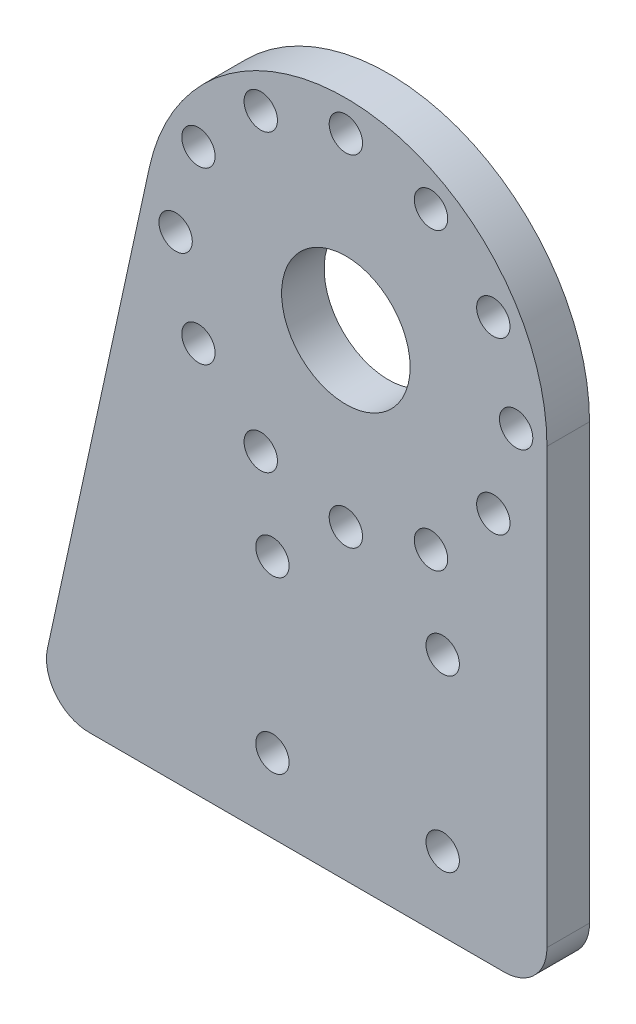
ISO-10303-21;
HEADER;
FILE_DESCRIPTION(('STEP AP214'),'2;1');
FILE_NAME('part.step','',(''),(''),'','','');
FILE_SCHEMA(('AUTOMOTIVE_DESIGN { 1 0 10303 214 1 1 1 1 }'));
ENDSEC;
DATA;
#1=APPLICATION_CONTEXT('core data for automotive mechanical design processes');
#2=APPLICATION_PROTOCOL_DEFINITION('international standard','automotive_design',2000,#1);
#3=PRODUCT_CONTEXT('',#1,'mechanical');
#4=PRODUCT('Part','Part','',(#3));
#5=PRODUCT_RELATED_PRODUCT_CATEGORY('part','',(#4));
#6=PRODUCT_DEFINITION_FORMATION('','',#4);
#7=PRODUCT_DEFINITION_CONTEXT('part definition',#1,'design');
#8=PRODUCT_DEFINITION('design','',#6,#7);
#9=PRODUCT_DEFINITION_SHAPE('','',#8);
#10=(LENGTH_UNIT() NAMED_UNIT(*) SI_UNIT(.MILLI.,.METRE.));
#11=(NAMED_UNIT(*) PLANE_ANGLE_UNIT() SI_UNIT($,.RADIAN.));
#12=(NAMED_UNIT(*) SI_UNIT($,.STERADIAN.) SOLID_ANGLE_UNIT());
#13=UNCERTAINTY_MEASURE_WITH_UNIT(LENGTH_MEASURE(1.E-05),#10,'distance_accuracy_value','');
#14=(GEOMETRIC_REPRESENTATION_CONTEXT(3) GLOBAL_UNCERTAINTY_ASSIGNED_CONTEXT((#13)) GLOBAL_UNIT_ASSIGNED_CONTEXT((#10,
#11,#12)) REPRESENTATION_CONTEXT('',''));
#15=CARTESIAN_POINT('',(0.,0.,0.));
#16=DIRECTION('',(0.,0.,1.));
#17=DIRECTION('',(1.,0.,0.));
#18=AXIS2_PLACEMENT_3D('',#15,#16,#17);
#19=CARTESIAN_POINT('',(406.399999999988,135.229599999999,0.));
#20=DIRECTION('',(0.,0.,1.));
#21=DIRECTION('',(1.,0.,0.));
#22=AXIS2_PLACEMENT_3D('',#19,#20,#21);
#23=CYLINDRICAL_SURFACE('',#22,2.48920000001143);
#24=CARTESIAN_POINT('',(406.399999999988,135.229599999999,0.));
#25=DIRECTION('',(0.,0.,1.));
#26=DIRECTION('',(1.,0.,0.));
#27=AXIS2_PLACEMENT_3D('',#24,#25,#26);
#28=CIRCLE('',#27,2.48920000001143);
#29=CARTESIAN_POINT('',(408.8892,135.229599999999,0.));
#30=VERTEX_POINT('',#29);
#31=EDGE_CURVE('E129',#30,#30,#28,.T.);
#32=ORIENTED_EDGE('',*,*,#31,.F.);
#33=EDGE_LOOP('',(#32));
#34=FACE_BOUND('',#33,.T.);
#35=CARTESIAN_POINT('',(406.399999999988,135.229599999999,6.35));
#36=DIRECTION('',(0.,0.,1.));
#37=DIRECTION('',(1.,0.,0.));
#38=AXIS2_PLACEMENT_3D('',#35,#36,#37);
#39=CIRCLE('',#38,2.48920000001143);
#40=CARTESIAN_POINT('',(408.8892,135.229599999999,6.35));
#41=VERTEX_POINT('',#40);
#42=EDGE_CURVE('E132',#41,#41,#39,.T.);
#43=ORIENTED_EDGE('',*,*,#42,.T.);
#44=EDGE_LOOP('',(#43));
#45=FACE_BOUND('',#44,.T.);
#46=ADVANCED_FACE('F39',(#34,#45),#23,.F.);
#47=CARTESIAN_POINT('',(380.999999999988,135.229599999999,0.));
#48=DIRECTION('',(0.,0.,1.));
#49=DIRECTION('',(1.,0.,0.));
#50=AXIS2_PLACEMENT_3D('',#47,#48,#49);
#51=CYLINDRICAL_SURFACE('',#50,2.48920000001143);
#52=CARTESIAN_POINT('',(380.999999999988,135.229599999999,0.));
#53=DIRECTION('',(0.,0.,1.));
#54=DIRECTION('',(1.,0.,0.));
#55=AXIS2_PLACEMENT_3D('',#52,#53,#54);
#56=CIRCLE('',#55,2.48920000001143);
#57=CARTESIAN_POINT('',(383.4892,135.229599999999,0.));
#58=VERTEX_POINT('',#57);
#59=EDGE_CURVE('E118',#58,#58,#56,.T.);
#60=ORIENTED_EDGE('',*,*,#59,.F.);
#61=EDGE_LOOP('',(#60));
#62=FACE_BOUND('',#61,.T.);
#63=CARTESIAN_POINT('',(380.999999999988,135.229599999999,6.35));
#64=DIRECTION('',(0.,0.,1.));
#65=DIRECTION('',(1.,0.,0.));
#66=AXIS2_PLACEMENT_3D('',#63,#64,#65);
#67=CIRCLE('',#66,2.48920000001143);
#68=CARTESIAN_POINT('',(383.4892,135.229599999999,6.35));
#69=VERTEX_POINT('',#68);
#70=EDGE_CURVE('E121',#69,#69,#67,.T.);
#71=ORIENTED_EDGE('',*,*,#70,.T.);
#72=EDGE_LOOP('',(#71));
#73=FACE_BOUND('',#72,.T.);
#74=ADVANCED_FACE('F312',(#62,#73),#51,.F.);
#75=CARTESIAN_POINT('',(421.956986168853,1.31739696694627E-12,6.35));
#76=DIRECTION('',(-1.,0.,0.));
#77=DIRECTION('',(0.,-1.,0.));
#78=AXIS2_PLACEMENT_3D('',#75,#76,#77);
#79=PLANE('',#78);
#80=DIRECTION('',(0.,1.,0.));
#81=VECTOR('',#80,1.);
#82=CARTESIAN_POINT('',(421.956986168853,1.31739696694627E-12,6.35));
#83=LINE('',#82,#81);
#84=CARTESIAN_POINT('',(421.956986168853,105.155999999999,6.35));
#85=VERTEX_POINT('',#84);
#86=CARTESIAN_POINT('',(421.956986168852,169.926,6.35));
#87=VERTEX_POINT('',#86);
#88=EDGE_CURVE('E93',#85,#87,#83,.T.);
#89=ORIENTED_EDGE('',*,*,#88,.F.);
#90=DIRECTION('',(0.,0.,-1.));
#91=VECTOR('',#90,1.);
#92=CARTESIAN_POINT('',(421.956986168853,105.155999999999,6.35));
#93=LINE('',#92,#91);
#94=CARTESIAN_POINT('',(421.956986168853,105.155999999999,0.));
#95=VERTEX_POINT('',#94);
#96=EDGE_CURVE('E135',#85,#95,#93,.T.);
#97=ORIENTED_EDGE('',*,*,#96,.T.);
#98=DIRECTION('',(0.,1.,0.));
#99=VECTOR('',#98,1.);
#100=CARTESIAN_POINT('',(421.956986168853,1.31739696694627E-12,0.));
#101=LINE('',#100,#99);
#102=CARTESIAN_POINT('',(421.956986168852,169.926,0.));
#103=VERTEX_POINT('',#102);
#104=EDGE_CURVE('E116',#95,#103,#101,.T.);
#105=ORIENTED_EDGE('',*,*,#104,.T.);
#106=DIRECTION('',(0.,0.,-1.));
#107=VECTOR('',#106,1.);
#108=CARTESIAN_POINT('',(421.956986168852,169.926,6.35));
#109=LINE('',#108,#107);
#110=EDGE_CURVE('E109',#87,#103,#109,.T.);
#111=ORIENTED_EDGE('',*,*,#110,.F.);
#112=EDGE_LOOP('',(#89,#97,#105,#111));
#113=FACE_BOUND('',#112,.T.);
#114=ADVANCED_FACE('F114',(#113),#79,.F.);
#115=CARTESIAN_POINT('',(391.956986224852,169.926,6.35));
#116=DIRECTION('',(0.,0.,-1.));
#117=DIRECTION('',(-1.,0.,0.));
#118=AXIS2_PLACEMENT_3D('',#115,#116,#117);
#119=CYLINDRICAL_SURFACE('',#118,29.999999944);
#120=CARTESIAN_POINT('',(391.956986224852,169.926,0.));
#121=DIRECTION('',(0.,0.,1.));
#122=DIRECTION('',(1.,0.,0.));
#123=AXIS2_PLACEMENT_3D('',#120,#121,#122);
#124=CIRCLE('',#123,29.999999944);
#125=CARTESIAN_POINT('',(362.644715782763,176.31276742725,0.));
#126=VERTEX_POINT('',#125);
#127=EDGE_CURVE('E159',#103,#126,#124,.T.);
#128=ORIENTED_EDGE('',*,*,#127,.T.);
#129=DIRECTION('',(0.,0.,-1.));
#130=VECTOR('',#129,1.);
#131=CARTESIAN_POINT('',(362.644715782763,176.31276742725,6.35));
#132=LINE('',#131,#130);
#133=CARTESIAN_POINT('',(362.644715782763,176.31276742725,6.35));
#134=VERTEX_POINT('',#133);
#135=EDGE_CURVE('E111',#134,#126,#132,.T.);
#136=ORIENTED_EDGE('',*,*,#135,.F.);
#137=CARTESIAN_POINT('',(391.956986224852,169.926,6.35));
#138=DIRECTION('',(0.,0.,1.));
#139=DIRECTION('',(1.,0.,0.));
#140=AXIS2_PLACEMENT_3D('',#137,#138,#139);
#141=CIRCLE('',#140,29.999999944);
#142=EDGE_CURVE('E97',#87,#134,#141,.T.);
#143=ORIENTED_EDGE('',*,*,#142,.F.);
#144=ORIENTED_EDGE('',*,*,#110,.T.);
#145=EDGE_LOOP('',(#128,#136,#143,#144));
#146=FACE_BOUND('',#145,.T.);
#147=ADVANCED_FACE('F108',(#146),#119,.T.);
#148=CARTESIAN_POINT('',(309.533386783101,-67.4433512838376,6.35));
#149=DIRECTION('',(0.977075683226871,-0.212892247972402,0.));
#150=DIRECTION('',(0.212892247972402,0.977075683226871,0.));
#151=AXIS2_PLACEMENT_3D('',#148,#149,#150);
#152=PLANE('',#151);
#153=DIRECTION('',(-0.212892247972402,-0.977075683226871,0.));
#154=VECTOR('',#153,1.);
#155=CARTESIAN_POINT('',(309.533386783101,-67.4433512838376,0.));
#156=LINE('',#155,#154);
#157=CARTESIAN_POINT('',(347.435123846915,106.507865774624,0.));
#158=VERTEX_POINT('',#157);
#159=EDGE_CURVE('E156',#126,#158,#156,.T.);
#160=ORIENTED_EDGE('',*,*,#159,.T.);
#161=DIRECTION('',(0.,0.,-1.));
#162=VECTOR('',#161,1.);
#163=CARTESIAN_POINT('',(347.435123846915,106.507865774624,6.35));
#164=LINE('',#163,#162);
#165=CARTESIAN_POINT('',(347.435123846915,106.507865774624,6.35));
#166=VERTEX_POINT('',#165);
#167=EDGE_CURVE('E11',#158,#166,#164,.F.);
#168=ORIENTED_EDGE('',*,*,#167,.T.);
#169=DIRECTION('',(-0.212892247972402,-0.977075683226871,0.));
#170=VECTOR('',#169,1.);
#171=CARTESIAN_POINT('',(309.533386783101,-67.4433512838376,6.35));
#172=LINE('',#171,#170);
#173=EDGE_CURVE('E112',#134,#166,#172,.T.);
#174=ORIENTED_EDGE('',*,*,#173,.F.);
#175=ORIENTED_EDGE('',*,*,#135,.T.);
#176=EDGE_LOOP('',(#160,#168,#174,#175));
#177=FACE_BOUND('',#176,.T.);
#178=ADVANCED_FACE('F158',(#177),#152,.F.);
#179=CARTESIAN_POINT('',(391.956986224852,195.326,6.35));
#180=DIRECTION('',(0.,0.,-1.));
#181=DIRECTION('',(-1.,0.,0.));
#182=AXIS2_PLACEMENT_3D('',#179,#180,#181);
#183=CYLINDRICAL_SURFACE('',#182,2.48920000000001);
#184=CARTESIAN_POINT('',(391.956986224852,195.326,6.35));
#185=DIRECTION('',(0.,0.,1.));
#186=DIRECTION('',(1.,0.,0.));
#187=AXIS2_PLACEMENT_3D('',#184,#185,#186);
#188=CIRCLE('',#187,2.48920000000001);
#189=CARTESIAN_POINT('',(394.446186224852,195.326,6.35));
#190=VERTEX_POINT('',#189);
#191=EDGE_CURVE('E104',#190,#190,#188,.T.);
#192=ORIENTED_EDGE('',*,*,#191,.T.);
#193=EDGE_LOOP('',(#192));
#194=FACE_BOUND('',#193,.T.);
#195=CARTESIAN_POINT('',(391.956986224852,195.326,0.));
#196=DIRECTION('',(0.,0.,1.));
#197=DIRECTION('',(1.,0.,0.));
#198=AXIS2_PLACEMENT_3D('',#195,#196,#197);
#199=CIRCLE('',#198,2.48920000000001);
#200=CARTESIAN_POINT('',(394.446186224852,195.326,0.));
#201=VERTEX_POINT('',#200);
#202=EDGE_CURVE('E165',#201,#201,#199,.T.);
#203=ORIENTED_EDGE('',*,*,#202,.F.);
#204=EDGE_LOOP('',(#203));
#205=FACE_BOUND('',#204,.T.);
#206=ADVANCED_FACE('F296',(#194,#205),#183,.F.);
#207=CARTESIAN_POINT('',(404.656986224852,191.923045256125,6.35));
#208=DIRECTION('',(0.,0.,-1.));
#209=DIRECTION('',(-1.,0.,0.));
#210=AXIS2_PLACEMENT_3D('',#207,#208,#209);
#211=CYLINDRICAL_SURFACE('',#210,2.48920000000001);
#212=CARTESIAN_POINT('',(404.656986224852,191.923045256125,6.35));
#213=DIRECTION('',(0.,0.,1.));
#214=DIRECTION('',(1.,0.,0.));
#215=AXIS2_PLACEMENT_3D('',#212,#213,#214);
#216=CIRCLE('',#215,2.48920000000001);
#217=CARTESIAN_POINT('',(407.146186224852,191.923045256125,6.35));
#218=VERTEX_POINT('',#217);
#219=EDGE_CURVE('E208',#218,#218,#216,.T.);
#220=ORIENTED_EDGE('',*,*,#219,.T.);
#221=EDGE_LOOP('',(#220));
#222=FACE_BOUND('',#221,.T.);
#223=CARTESIAN_POINT('',(404.656986224852,191.923045256125,0.));
#224=DIRECTION('',(0.,0.,1.));
#225=DIRECTION('',(1.,0.,0.));
#226=AXIS2_PLACEMENT_3D('',#223,#224,#225);
#227=CIRCLE('',#226,2.48920000000001);
#228=CARTESIAN_POINT('',(407.146186224852,191.923045256125,0.));
#229=VERTEX_POINT('',#228);
#230=EDGE_CURVE('E168',#229,#229,#227,.T.);
#231=ORIENTED_EDGE('',*,*,#230,.F.);
#232=EDGE_LOOP('',(#231));
#233=FACE_BOUND('',#232,.T.);
#234=ADVANCED_FACE('F299',(#222,#233),#211,.F.);
#235=CARTESIAN_POINT('',(413.954031480977,182.626,6.35));
#236=DIRECTION('',(0.,0.,-1.));
#237=DIRECTION('',(-1.,0.,0.));
#238=AXIS2_PLACEMENT_3D('',#235,#236,#237);
#239=CYLINDRICAL_SURFACE('',#238,2.48920000000001);
#240=CARTESIAN_POINT('',(413.954031480977,182.626,6.35));
#241=DIRECTION('',(0.,0.,1.));
#242=DIRECTION('',(1.,0.,0.));
#243=AXIS2_PLACEMENT_3D('',#240,#241,#242);
#244=CIRCLE('',#243,2.48920000000001);
#245=CARTESIAN_POINT('',(416.443231480977,182.626,6.35));
#246=VERTEX_POINT('',#245);
#247=EDGE_CURVE('E211',#246,#246,#244,.T.);
#248=ORIENTED_EDGE('',*,*,#247,.T.);
#249=EDGE_LOOP('',(#248));
#250=FACE_BOUND('',#249,.T.);
#251=CARTESIAN_POINT('',(413.954031480977,182.626,0.));
#252=DIRECTION('',(0.,0.,1.));
#253=DIRECTION('',(1.,0.,0.));
#254=AXIS2_PLACEMENT_3D('',#251,#252,#253);
#255=CIRCLE('',#254,2.48920000000001);
#256=CARTESIAN_POINT('',(416.443231480977,182.626,0.));
#257=VERTEX_POINT('',#256);
#258=EDGE_CURVE('E171',#257,#257,#255,.T.);
#259=ORIENTED_EDGE('',*,*,#258,.F.);
#260=EDGE_LOOP('',(#259));
#261=FACE_BOUND('',#260,.T.);
#262=ADVANCED_FACE('F511',(#250,#261),#239,.F.);
#263=CARTESIAN_POINT('',(417.356986224852,169.926,6.35));
#264=DIRECTION('',(0.,0.,-1.));
#265=DIRECTION('',(-1.,0.,0.));
#266=AXIS2_PLACEMENT_3D('',#263,#264,#265);
#267=CYLINDRICAL_SURFACE('',#266,2.48920000000001);
#268=CARTESIAN_POINT('',(417.356986224852,169.926,6.35));
#269=DIRECTION('',(0.,0.,1.));
#270=DIRECTION('',(1.,0.,0.));
#271=AXIS2_PLACEMENT_3D('',#268,#269,#270);
#272=CIRCLE('',#271,2.48920000000001);
#273=CARTESIAN_POINT('',(419.846186224852,169.926,6.35));
#274=VERTEX_POINT('',#273);
#275=EDGE_CURVE('E214',#274,#274,#272,.T.);
#276=ORIENTED_EDGE('',*,*,#275,.T.);
#277=EDGE_LOOP('',(#276));
#278=FACE_BOUND('',#277,.T.);
#279=CARTESIAN_POINT('',(417.356986224852,169.926,0.));
#280=DIRECTION('',(0.,0.,1.));
#281=DIRECTION('',(1.,0.,0.));
#282=AXIS2_PLACEMENT_3D('',#279,#280,#281);
#283=CIRCLE('',#282,2.48920000000001);
#284=CARTESIAN_POINT('',(419.846186224852,169.926,0.));
#285=VERTEX_POINT('',#284);
#286=EDGE_CURVE('E174',#285,#285,#283,.T.);
#287=ORIENTED_EDGE('',*,*,#286,.F.);
#288=EDGE_LOOP('',(#287));
#289=FACE_BOUND('',#288,.T.);
#290=ADVANCED_FACE('F500',(#278,#289),#267,.F.);
#291=CARTESIAN_POINT('',(413.954031480977,157.226,6.35));
#292=DIRECTION('',(0.,0.,-1.));
#293=DIRECTION('',(-1.,0.,0.));
#294=AXIS2_PLACEMENT_3D('',#291,#292,#293);
#295=CYLINDRICAL_SURFACE('',#294,2.48920000000001);
#296=CARTESIAN_POINT('',(413.954031480977,157.226,6.35));
#297=DIRECTION('',(0.,0.,1.));
#298=DIRECTION('',(1.,0.,0.));
#299=AXIS2_PLACEMENT_3D('',#296,#297,#298);
#300=CIRCLE('',#299,2.48920000000001);
#301=CARTESIAN_POINT('',(416.443231480977,157.226,6.35));
#302=VERTEX_POINT('',#301);
#303=EDGE_CURVE('E217',#302,#302,#300,.T.);
#304=ORIENTED_EDGE('',*,*,#303,.T.);
#305=EDGE_LOOP('',(#304));
#306=FACE_BOUND('',#305,.T.);
#307=CARTESIAN_POINT('',(413.954031480977,157.226,0.));
#308=DIRECTION('',(0.,0.,1.));
#309=DIRECTION('',(1.,0.,0.));
#310=AXIS2_PLACEMENT_3D('',#307,#308,#309);
#311=CIRCLE('',#310,2.48920000000001);
#312=CARTESIAN_POINT('',(416.443231480977,157.226,0.));
#313=VERTEX_POINT('',#312);
#314=EDGE_CURVE('E177',#313,#313,#311,.T.);
#315=ORIENTED_EDGE('',*,*,#314,.F.);
#316=EDGE_LOOP('',(#315));
#317=FACE_BOUND('',#316,.T.);
#318=ADVANCED_FACE('F489',(#306,#317),#295,.F.);
#319=CARTESIAN_POINT('',(404.656986224852,147.928954743875,6.35));
#320=DIRECTION('',(0.,0.,-1.));
#321=DIRECTION('',(-1.,0.,0.));
#322=AXIS2_PLACEMENT_3D('',#319,#320,#321);
#323=CYLINDRICAL_SURFACE('',#322,2.48920000000001);
#324=CARTESIAN_POINT('',(404.656986224852,147.928954743875,6.35));
#325=DIRECTION('',(0.,0.,1.));
#326=DIRECTION('',(1.,0.,0.));
#327=AXIS2_PLACEMENT_3D('',#324,#325,#326);
#328=CIRCLE('',#327,2.48920000000001);
#329=CARTESIAN_POINT('',(407.146186224852,147.928954743875,6.35));
#330=VERTEX_POINT('',#329);
#331=EDGE_CURVE('E220',#330,#330,#328,.T.);
#332=ORIENTED_EDGE('',*,*,#331,.T.);
#333=EDGE_LOOP('',(#332));
#334=FACE_BOUND('',#333,.T.);
#335=CARTESIAN_POINT('',(404.656986224852,147.928954743875,0.));
#336=DIRECTION('',(0.,0.,1.));
#337=DIRECTION('',(1.,0.,0.));
#338=AXIS2_PLACEMENT_3D('',#335,#336,#337);
#339=CIRCLE('',#338,2.48920000000001);
#340=CARTESIAN_POINT('',(407.146186224852,147.928954743875,0.));
#341=VERTEX_POINT('',#340);
#342=EDGE_CURVE('E180',#341,#341,#339,.T.);
#343=ORIENTED_EDGE('',*,*,#342,.F.);
#344=EDGE_LOOP('',(#343));
#345=FACE_BOUND('',#344,.T.);
#346=ADVANCED_FACE('F478',(#334,#345),#323,.F.);
#347=CARTESIAN_POINT('',(391.956986224852,144.526,6.35));
#348=DIRECTION('',(0.,0.,-1.));
#349=DIRECTION('',(-1.,0.,0.));
#350=AXIS2_PLACEMENT_3D('',#347,#348,#349);
#351=CYLINDRICAL_SURFACE('',#350,2.48920000000001);
#352=CARTESIAN_POINT('',(391.956986224852,144.526,6.35));
#353=DIRECTION('',(0.,0.,1.));
#354=DIRECTION('',(1.,0.,0.));
#355=AXIS2_PLACEMENT_3D('',#352,#353,#354);
#356=CIRCLE('',#355,2.48920000000001);
#357=CARTESIAN_POINT('',(394.446186224852,144.526,6.35));
#358=VERTEX_POINT('',#357);
#359=EDGE_CURVE('E223',#358,#358,#356,.T.);
#360=ORIENTED_EDGE('',*,*,#359,.T.);
#361=EDGE_LOOP('',(#360));
#362=FACE_BOUND('',#361,.T.);
#363=CARTESIAN_POINT('',(391.956986224852,144.526,0.));
#364=DIRECTION('',(0.,0.,1.));
#365=DIRECTION('',(1.,0.,0.));
#366=AXIS2_PLACEMENT_3D('',#363,#364,#365);
#367=CIRCLE('',#366,2.48920000000001);
#368=CARTESIAN_POINT('',(394.446186224852,144.526,0.));
#369=VERTEX_POINT('',#368);
#370=EDGE_CURVE('E183',#369,#369,#367,.T.);
#371=ORIENTED_EDGE('',*,*,#370,.F.);
#372=EDGE_LOOP('',(#371));
#373=FACE_BOUND('',#372,.T.);
#374=ADVANCED_FACE('F467',(#362,#373),#351,.F.);
#375=CARTESIAN_POINT('',(379.256986224852,147.928954743875,6.35));
#376=DIRECTION('',(0.,0.,-1.));
#377=DIRECTION('',(-1.,0.,0.));
#378=AXIS2_PLACEMENT_3D('',#375,#376,#377);
#379=CYLINDRICAL_SURFACE('',#378,2.48920000000001);
#380=CARTESIAN_POINT('',(379.256986224852,147.928954743875,6.35));
#381=DIRECTION('',(0.,0.,1.));
#382=DIRECTION('',(1.,0.,0.));
#383=AXIS2_PLACEMENT_3D('',#380,#381,#382);
#384=CIRCLE('',#383,2.48920000000001);
#385=CARTESIAN_POINT('',(381.746186224853,147.928954743875,6.35));
#386=VERTEX_POINT('',#385);
#387=EDGE_CURVE('E226',#386,#386,#384,.T.);
#388=ORIENTED_EDGE('',*,*,#387,.T.);
#389=EDGE_LOOP('',(#388));
#390=FACE_BOUND('',#389,.T.);
#391=CARTESIAN_POINT('',(379.256986224852,147.928954743875,0.));
#392=DIRECTION('',(0.,0.,1.));
#393=DIRECTION('',(1.,0.,0.));
#394=AXIS2_PLACEMENT_3D('',#391,#392,#393);
#395=CIRCLE('',#394,2.48920000000001);
#396=CARTESIAN_POINT('',(381.746186224853,147.928954743875,0.));
#397=VERTEX_POINT('',#396);
#398=EDGE_CURVE('E186',#397,#397,#395,.T.);
#399=ORIENTED_EDGE('',*,*,#398,.F.);
#400=EDGE_LOOP('',(#399));
#401=FACE_BOUND('',#400,.T.);
#402=ADVANCED_FACE('F456',(#390,#401),#379,.F.);
#403=CARTESIAN_POINT('',(369.959940968728,157.226,6.35));
#404=DIRECTION('',(0.,0.,-1.));
#405=DIRECTION('',(-1.,0.,0.));
#406=AXIS2_PLACEMENT_3D('',#403,#404,#405);
#407=CYLINDRICAL_SURFACE('',#406,2.48919999999995);
#408=CARTESIAN_POINT('',(369.959940968728,157.226,6.35));
#409=DIRECTION('',(0.,0.,1.));
#410=DIRECTION('',(1.,0.,0.));
#411=AXIS2_PLACEMENT_3D('',#408,#409,#410);
#412=CIRCLE('',#411,2.48919999999995);
#413=CARTESIAN_POINT('',(372.449140968728,157.226,6.35));
#414=VERTEX_POINT('',#413);
#415=EDGE_CURVE('E229',#414,#414,#412,.T.);
#416=ORIENTED_EDGE('',*,*,#415,.T.);
#417=EDGE_LOOP('',(#416));
#418=FACE_BOUND('',#417,.T.);
#419=CARTESIAN_POINT('',(369.959940968728,157.226,0.));
#420=DIRECTION('',(0.,0.,1.));
#421=DIRECTION('',(1.,0.,0.));
#422=AXIS2_PLACEMENT_3D('',#419,#420,#421);
#423=CIRCLE('',#422,2.48919999999995);
#424=CARTESIAN_POINT('',(372.449140968728,157.226,0.));
#425=VERTEX_POINT('',#424);
#426=EDGE_CURVE('E189',#425,#425,#423,.T.);
#427=ORIENTED_EDGE('',*,*,#426,.F.);
#428=EDGE_LOOP('',(#427));
#429=FACE_BOUND('',#428,.T.);
#430=ADVANCED_FACE('F445',(#418,#429),#407,.F.);
#431=CARTESIAN_POINT('',(366.556986224852,169.926,6.35));
#432=DIRECTION('',(0.,0.,-1.));
#433=DIRECTION('',(-1.,0.,0.));
#434=AXIS2_PLACEMENT_3D('',#431,#432,#433);
#435=CYLINDRICAL_SURFACE('',#434,2.48920000000001);
#436=CARTESIAN_POINT('',(366.556986224852,169.926,6.35));
#437=DIRECTION('',(0.,0.,1.));
#438=DIRECTION('',(1.,0.,0.));
#439=AXIS2_PLACEMENT_3D('',#436,#437,#438);
#440=CIRCLE('',#439,2.48920000000001);
#441=CARTESIAN_POINT('',(369.046186224852,169.926,6.35));
#442=VERTEX_POINT('',#441);
#443=EDGE_CURVE('E232',#442,#442,#440,.T.);
#444=ORIENTED_EDGE('',*,*,#443,.T.);
#445=EDGE_LOOP('',(#444));
#446=FACE_BOUND('',#445,.T.);
#447=CARTESIAN_POINT('',(366.556986224852,169.926,0.));
#448=DIRECTION('',(0.,0.,1.));
#449=DIRECTION('',(1.,0.,0.));
#450=AXIS2_PLACEMENT_3D('',#447,#448,#449);
#451=CIRCLE('',#450,2.48920000000001);
#452=CARTESIAN_POINT('',(369.046186224852,169.926,0.));
#453=VERTEX_POINT('',#452);
#454=EDGE_CURVE('E192',#453,#453,#451,.T.);
#455=ORIENTED_EDGE('',*,*,#454,.F.);
#456=EDGE_LOOP('',(#455));
#457=FACE_BOUND('',#456,.T.);
#458=ADVANCED_FACE('F434',(#446,#457),#435,.F.);
#459=CARTESIAN_POINT('',(369.959940968728,182.626,6.35));
#460=DIRECTION('',(0.,0.,-1.));
#461=DIRECTION('',(-1.,0.,0.));
#462=AXIS2_PLACEMENT_3D('',#459,#460,#461);
#463=CYLINDRICAL_SURFACE('',#462,2.48920000000001);
#464=CARTESIAN_POINT('',(369.959940968728,182.626,6.35));
#465=DIRECTION('',(0.,0.,1.));
#466=DIRECTION('',(1.,0.,0.));
#467=AXIS2_PLACEMENT_3D('',#464,#465,#466);
#468=CIRCLE('',#467,2.48920000000001);
#469=CARTESIAN_POINT('',(372.449140968728,182.626,6.35));
#470=VERTEX_POINT('',#469);
#471=EDGE_CURVE('E235',#470,#470,#468,.T.);
#472=ORIENTED_EDGE('',*,*,#471,.T.);
#473=EDGE_LOOP('',(#472));
#474=FACE_BOUND('',#473,.T.);
#475=CARTESIAN_POINT('',(369.959940968728,182.626,0.));
#476=DIRECTION('',(0.,0.,1.));
#477=DIRECTION('',(1.,0.,0.));
#478=AXIS2_PLACEMENT_3D('',#475,#476,#477);
#479=CIRCLE('',#478,2.48920000000001);
#480=CARTESIAN_POINT('',(372.449140968728,182.626,0.));
#481=VERTEX_POINT('',#480);
#482=EDGE_CURVE('E195',#481,#481,#479,.T.);
#483=ORIENTED_EDGE('',*,*,#482,.F.);
#484=EDGE_LOOP('',(#483));
#485=FACE_BOUND('',#484,.T.);
#486=ADVANCED_FACE('F423',(#474,#485),#463,.F.);
#487=CARTESIAN_POINT('',(379.256986224852,191.923045256125,6.35));
#488=DIRECTION('',(0.,0.,-1.));
#489=DIRECTION('',(-1.,0.,0.));
#490=AXIS2_PLACEMENT_3D('',#487,#488,#489);
#491=CYLINDRICAL_SURFACE('',#490,2.48919999999995);
#492=CARTESIAN_POINT('',(379.256986224852,191.923045256125,6.35));
#493=DIRECTION('',(0.,0.,1.));
#494=DIRECTION('',(1.,0.,0.));
#495=AXIS2_PLACEMENT_3D('',#492,#493,#494);
#496=CIRCLE('',#495,2.48919999999995);
#497=CARTESIAN_POINT('',(381.746186224852,191.923045256125,6.35));
#498=VERTEX_POINT('',#497);
#499=EDGE_CURVE('E238',#498,#498,#496,.T.);
#500=ORIENTED_EDGE('',*,*,#499,.T.);
#501=EDGE_LOOP('',(#500));
#502=FACE_BOUND('',#501,.T.);
#503=CARTESIAN_POINT('',(379.256986224852,191.923045256125,0.));
#504=DIRECTION('',(0.,0.,1.));
#505=DIRECTION('',(1.,0.,0.));
#506=AXIS2_PLACEMENT_3D('',#503,#504,#505);
#507=CIRCLE('',#506,2.48919999999995);
#508=CARTESIAN_POINT('',(381.746186224852,191.923045256125,0.));
#509=VERTEX_POINT('',#508);
#510=EDGE_CURVE('E198',#509,#509,#507,.T.);
#511=ORIENTED_EDGE('',*,*,#510,.F.);
#512=EDGE_LOOP('',(#511));
#513=FACE_BOUND('',#512,.T.);
#514=ADVANCED_FACE('F413',(#502,#513),#491,.F.);
#515=CARTESIAN_POINT('',(391.956986224852,169.926,6.35));
#516=DIRECTION('',(0.,0.,-1.));
#517=DIRECTION('',(-1.,0.,0.));
#518=AXIS2_PLACEMENT_3D('',#515,#516,#517);
#519=CYLINDRICAL_SURFACE('',#518,9.5885);
#520=CARTESIAN_POINT('',(391.956986224852,169.926,6.35));
#521=DIRECTION('',(0.,0.,1.));
#522=DIRECTION('',(1.,0.,0.));
#523=AXIS2_PLACEMENT_3D('',#520,#521,#522);
#524=CIRCLE('',#523,9.5885);
#525=CARTESIAN_POINT('',(401.545486224852,169.926,6.35));
#526=VERTEX_POINT('',#525);
#527=EDGE_CURVE('E161',#526,#526,#524,.T.);
#528=ORIENTED_EDGE('',*,*,#527,.T.);
#529=EDGE_LOOP('',(#528));
#530=FACE_BOUND('',#529,.T.);
#531=CARTESIAN_POINT('',(391.956986224852,169.926,0.));
#532=DIRECTION('',(0.,0.,1.));
#533=DIRECTION('',(1.,0.,0.));
#534=AXIS2_PLACEMENT_3D('',#531,#532,#533);
#535=CIRCLE('',#534,9.5885);
#536=CARTESIAN_POINT('',(401.545486224852,169.926,0.));
#537=VERTEX_POINT('',#536);
#538=EDGE_CURVE('E201',#537,#537,#535,.T.);
#539=ORIENTED_EDGE('',*,*,#538,.F.);
#540=EDGE_LOOP('',(#539));
#541=FACE_BOUND('',#540,.T.);
#542=ADVANCED_FACE('F359',(#530,#541),#519,.F.);
#543=CARTESIAN_POINT('',(0.,98.8059999999991,6.35));
#544=DIRECTION('',(0.,1.,0.));
#545=DIRECTION('',(0.,0.,1.));
#546=AXIS2_PLACEMENT_3D('',#543,#544,#545);
#547=PLANE('',#546);
#548=DIRECTION('',(1.,0.,0.));
#549=VECTOR('',#548,1.);
#550=CARTESIAN_POINT('',(0.,98.8059999999991,0.));
#551=LINE('',#550,#549);
#552=CARTESIAN_POINT('',(353.639554435406,98.8059999999991,0.));
#553=VERTEX_POINT('',#552);
#554=CARTESIAN_POINT('',(415.606986168853,98.8059999999991,0.));
#555=VERTEX_POINT('',#554);
#556=EDGE_CURVE('E157',#553,#555,#551,.T.);
#557=ORIENTED_EDGE('',*,*,#556,.T.);
#558=DIRECTION('',(0.,0.,-1.));
#559=VECTOR('',#558,1.);
#560=CARTESIAN_POINT('',(415.606986168853,98.8059999999991,6.35));
#561=LINE('',#560,#559);
#562=CARTESIAN_POINT('',(415.606986168853,98.8059999999991,6.35));
#563=VERTEX_POINT('',#562);
#564=EDGE_CURVE('E60',#555,#563,#561,.F.);
#565=ORIENTED_EDGE('',*,*,#564,.T.);
#566=DIRECTION('',(1.,0.,0.));
#567=VECTOR('',#566,1.);
#568=CARTESIAN_POINT('',(0.,98.8059999999991,6.35));
#569=LINE('',#568,#567);
#570=CARTESIAN_POINT('',(353.639554435406,98.8059999999991,6.35));
#571=VERTEX_POINT('',#570);
#572=EDGE_CURVE('E123',#571,#563,#569,.T.);
#573=ORIENTED_EDGE('',*,*,#572,.F.);
#574=DIRECTION('',(0.,0.,-1.));
#575=VECTOR('',#574,1.);
#576=CARTESIAN_POINT('',(353.639554435406,98.8059999999991,6.35));
#577=LINE('',#576,#575);
#578=EDGE_CURVE('E141',#571,#553,#577,.T.);
#579=ORIENTED_EDGE('',*,*,#578,.T.);
#580=EDGE_LOOP('',(#557,#565,#573,#579));
#581=FACE_BOUND('',#580,.T.);
#582=ADVANCED_FACE('F149',(#581),#547,.F.);
#583=CARTESIAN_POINT('',(0.,0.,6.35));
#584=DIRECTION('',(0.,0.,1.));
#585=DIRECTION('',(1.,0.,0.));
#586=AXIS2_PLACEMENT_3D('',#583,#584,#585);
#587=PLANE('',#586);
#588=CARTESIAN_POINT('',(406.399999999988,109.829599999999,6.35));
#589=DIRECTION('',(0.,0.,1.));
#590=DIRECTION('',(1.,0.,0.));
#591=AXIS2_PLACEMENT_3D('',#588,#589,#590);
#592=CIRCLE('',#591,2.48920000001143);
#593=CARTESIAN_POINT('',(408.8892,109.829599999999,6.35));
#594=VERTEX_POINT('',#593);
#595=EDGE_CURVE('E246',#594,#594,#592,.T.);
#596=ORIENTED_EDGE('',*,*,#595,.F.);
#597=EDGE_LOOP('',(#596));
#598=FACE_BOUND('',#597,.T.);
#599=CARTESIAN_POINT('',(380.999999999988,109.829599999999,6.35));
#600=DIRECTION('',(0.,0.,1.));
#601=DIRECTION('',(1.,0.,0.));
#602=AXIS2_PLACEMENT_3D('',#599,#600,#601);
#603=CIRCLE('',#602,2.48920000001143);
#604=CARTESIAN_POINT('',(383.4892,109.829599999999,6.35));
#605=VERTEX_POINT('',#604);
#606=EDGE_CURVE('E243',#605,#605,#603,.T.);
#607=ORIENTED_EDGE('',*,*,#606,.F.);
#608=EDGE_LOOP('',(#607));
#609=FACE_BOUND('',#608,.T.);
#610=ORIENTED_EDGE('',*,*,#527,.F.);
#611=EDGE_LOOP('',(#610));
#612=FACE_BOUND('',#611,.T.);
#613=ORIENTED_EDGE('',*,*,#499,.F.);
#614=EDGE_LOOP('',(#613));
#615=FACE_BOUND('',#614,.T.);
#616=ORIENTED_EDGE('',*,*,#471,.F.);
#617=EDGE_LOOP('',(#616));
#618=FACE_BOUND('',#617,.T.);
#619=ORIENTED_EDGE('',*,*,#443,.F.);
#620=EDGE_LOOP('',(#619));
#621=FACE_BOUND('',#620,.T.);
#622=ORIENTED_EDGE('',*,*,#415,.F.);
#623=EDGE_LOOP('',(#622));
#624=FACE_BOUND('',#623,.T.);
#625=ORIENTED_EDGE('',*,*,#387,.F.);
#626=EDGE_LOOP('',(#625));
#627=FACE_BOUND('',#626,.T.);
#628=ORIENTED_EDGE('',*,*,#359,.F.);
#629=EDGE_LOOP('',(#628));
#630=FACE_BOUND('',#629,.T.);
#631=ORIENTED_EDGE('',*,*,#331,.F.);
#632=EDGE_LOOP('',(#631));
#633=FACE_BOUND('',#632,.T.);
#634=ORIENTED_EDGE('',*,*,#303,.F.);
#635=EDGE_LOOP('',(#634));
#636=FACE_BOUND('',#635,.T.);
#637=ORIENTED_EDGE('',*,*,#275,.F.);
#638=EDGE_LOOP('',(#637));
#639=FACE_BOUND('',#638,.T.);
#640=ORIENTED_EDGE('',*,*,#247,.F.);
#641=EDGE_LOOP('',(#640));
#642=FACE_BOUND('',#641,.T.);
#643=ORIENTED_EDGE('',*,*,#219,.F.);
#644=EDGE_LOOP('',(#643));
#645=FACE_BOUND('',#644,.T.);
#646=ORIENTED_EDGE('',*,*,#191,.F.);
#647=EDGE_LOOP('',(#646));
#648=FACE_BOUND('',#647,.T.);
#649=ORIENTED_EDGE('',*,*,#572,.T.);
#650=CARTESIAN_POINT('',(415.606986168853,105.155999999999,6.35));
#651=DIRECTION('',(0.,0.,1.));
#652=DIRECTION('',(1.,0.,0.));
#653=AXIS2_PLACEMENT_3D('',#650,#651,#652);
#654=CIRCLE('',#653,6.35);
#655=EDGE_CURVE('E47',#563,#85,#654,.T.);
#656=ORIENTED_EDGE('',*,*,#655,.T.);
#657=ORIENTED_EDGE('',*,*,#88,.T.);
#658=ORIENTED_EDGE('',*,*,#142,.T.);
#659=ORIENTED_EDGE('',*,*,#173,.T.);
#660=CARTESIAN_POINT('',(353.639554435406,105.155999999999,6.35));
#661=DIRECTION('',(0.,0.,1.));
#662=DIRECTION('',(1.,0.,0.));
#663=AXIS2_PLACEMENT_3D('',#660,#661,#662);
#664=CIRCLE('',#663,6.35);
#665=EDGE_CURVE('E145',#166,#571,#664,.T.);
#666=ORIENTED_EDGE('',*,*,#665,.T.);
#667=EDGE_LOOP('',(#649,#656,#657,#658,#659,#666));
#668=FACE_BOUND('',#667,.T.);
#669=ORIENTED_EDGE('',*,*,#70,.F.);
#670=EDGE_LOOP('',(#669));
#671=FACE_BOUND('',#670,.T.);
#672=ORIENTED_EDGE('',*,*,#42,.F.);
#673=EDGE_LOOP('',(#672));
#674=FACE_BOUND('',#673,.T.);
#675=ADVANCED_FACE('F95',(#598,#609,#612,#615,#618,#621,#624,#627,#630,#633,#636,#639,#642,#645,
#648,#668,#671,#674),#587,.T.);
#676=CARTESIAN_POINT('',(0.,0.,0.));
#677=DIRECTION('',(0.,0.,1.));
#678=DIRECTION('',(1.,0.,0.));
#679=AXIS2_PLACEMENT_3D('',#676,#677,#678);
#680=PLANE('',#679);
#681=CARTESIAN_POINT('',(406.399999999988,109.829599999999,0.));
#682=DIRECTION('',(0.,0.,1.));
#683=DIRECTION('',(1.,0.,0.));
#684=AXIS2_PLACEMENT_3D('',#681,#682,#683);
#685=CIRCLE('',#684,2.48920000001143);
#686=CARTESIAN_POINT('',(408.8892,109.829599999999,0.));
#687=VERTEX_POINT('',#686);
#688=EDGE_CURVE('E251',#687,#687,#685,.T.);
#689=ORIENTED_EDGE('',*,*,#688,.T.);
#690=EDGE_LOOP('',(#689));
#691=FACE_BOUND('',#690,.T.);
#692=CARTESIAN_POINT('',(380.999999999988,109.829599999999,0.));
#693=DIRECTION('',(0.,0.,1.));
#694=DIRECTION('',(1.,0.,0.));
#695=AXIS2_PLACEMENT_3D('',#692,#693,#694);
#696=CIRCLE('',#695,2.48920000001143);
#697=CARTESIAN_POINT('',(383.4892,109.829599999999,0.));
#698=VERTEX_POINT('',#697);
#699=EDGE_CURVE('E203',#698,#698,#696,.T.);
#700=ORIENTED_EDGE('',*,*,#699,.T.);
#701=EDGE_LOOP('',(#700));
#702=FACE_BOUND('',#701,.T.);
#703=ORIENTED_EDGE('',*,*,#538,.T.);
#704=EDGE_LOOP('',(#703));
#705=FACE_BOUND('',#704,.T.);
#706=ORIENTED_EDGE('',*,*,#510,.T.);
#707=EDGE_LOOP('',(#706));
#708=FACE_BOUND('',#707,.T.);
#709=ORIENTED_EDGE('',*,*,#482,.T.);
#710=EDGE_LOOP('',(#709));
#711=FACE_BOUND('',#710,.T.);
#712=ORIENTED_EDGE('',*,*,#454,.T.);
#713=EDGE_LOOP('',(#712));
#714=FACE_BOUND('',#713,.T.);
#715=ORIENTED_EDGE('',*,*,#426,.T.);
#716=EDGE_LOOP('',(#715));
#717=FACE_BOUND('',#716,.T.);
#718=ORIENTED_EDGE('',*,*,#398,.T.);
#719=EDGE_LOOP('',(#718));
#720=FACE_BOUND('',#719,.T.);
#721=ORIENTED_EDGE('',*,*,#370,.T.);
#722=EDGE_LOOP('',(#721));
#723=FACE_BOUND('',#722,.T.);
#724=ORIENTED_EDGE('',*,*,#342,.T.);
#725=EDGE_LOOP('',(#724));
#726=FACE_BOUND('',#725,.T.);
#727=ORIENTED_EDGE('',*,*,#314,.T.);
#728=EDGE_LOOP('',(#727));
#729=FACE_BOUND('',#728,.T.);
#730=ORIENTED_EDGE('',*,*,#286,.T.);
#731=EDGE_LOOP('',(#730));
#732=FACE_BOUND('',#731,.T.);
#733=ORIENTED_EDGE('',*,*,#258,.T.);
#734=EDGE_LOOP('',(#733));
#735=FACE_BOUND('',#734,.T.);
#736=ORIENTED_EDGE('',*,*,#230,.T.);
#737=EDGE_LOOP('',(#736));
#738=FACE_BOUND('',#737,.T.);
#739=ORIENTED_EDGE('',*,*,#202,.T.);
#740=EDGE_LOOP('',(#739));
#741=FACE_BOUND('',#740,.T.);
#742=ORIENTED_EDGE('',*,*,#104,.F.);
#743=CARTESIAN_POINT('',(415.606986168853,105.155999999999,0.));
#744=DIRECTION('',(0.,0.,1.));
#745=DIRECTION('',(1.,0.,0.));
#746=AXIS2_PLACEMENT_3D('',#743,#744,#745);
#747=CIRCLE('',#746,6.35);
#748=EDGE_CURVE('E139',#95,#555,#747,.F.);
#749=ORIENTED_EDGE('',*,*,#748,.T.);
#750=ORIENTED_EDGE('',*,*,#556,.F.);
#751=CARTESIAN_POINT('',(353.639554435406,105.155999999999,0.));
#752=DIRECTION('',(0.,0.,1.));
#753=DIRECTION('',(1.,0.,0.));
#754=AXIS2_PLACEMENT_3D('',#751,#752,#753);
#755=CIRCLE('',#754,6.35);
#756=EDGE_CURVE('E137',#553,#158,#755,.F.);
#757=ORIENTED_EDGE('',*,*,#756,.T.);
#758=ORIENTED_EDGE('',*,*,#159,.F.);
#759=ORIENTED_EDGE('',*,*,#127,.F.);
#760=EDGE_LOOP('',(#742,#749,#750,#757,#758,#759));
#761=FACE_BOUND('',#760,.T.);
#762=ORIENTED_EDGE('',*,*,#59,.T.);
#763=EDGE_LOOP('',(#762));
#764=FACE_BOUND('',#763,.T.);
#765=ORIENTED_EDGE('',*,*,#31,.T.);
#766=EDGE_LOOP('',(#765));
#767=FACE_BOUND('',#766,.T.);
#768=ADVANCED_FACE('F154',(#691,#702,#705,#708,#711,#714,#717,#720,#723,#726,#729,#732,#735,
#738,#741,#761,#764,#767),#680,.F.);
#769=CARTESIAN_POINT('',(380.999999999988,109.829599999999,0.));
#770=DIRECTION('',(0.,0.,1.));
#771=DIRECTION('',(1.,0.,0.));
#772=AXIS2_PLACEMENT_3D('',#769,#770,#771);
#773=CYLINDRICAL_SURFACE('',#772,2.48920000001143);
#774=ORIENTED_EDGE('',*,*,#699,.F.);
#775=EDGE_LOOP('',(#774));
#776=FACE_BOUND('',#775,.T.);
#777=ORIENTED_EDGE('',*,*,#606,.T.);
#778=EDGE_LOOP('',(#777));
#779=FACE_BOUND('',#778,.T.);
#780=ADVANCED_FACE('F261',(#776,#779),#773,.F.);
#781=CARTESIAN_POINT('',(406.399999999988,109.829599999999,0.));
#782=DIRECTION('',(0.,0.,1.));
#783=DIRECTION('',(1.,0.,0.));
#784=AXIS2_PLACEMENT_3D('',#781,#782,#783);
#785=CYLINDRICAL_SURFACE('',#784,2.48920000001143);
#786=ORIENTED_EDGE('',*,*,#688,.F.);
#787=EDGE_LOOP('',(#786));
#788=FACE_BOUND('',#787,.T.);
#789=ORIENTED_EDGE('',*,*,#595,.T.);
#790=EDGE_LOOP('',(#789));
#791=FACE_BOUND('',#790,.T.);
#792=ADVANCED_FACE('F257',(#788,#791),#785,.F.);
#793=CARTESIAN_POINT('',(415.606986168853,105.155999999999,6.35));
#794=DIRECTION('',(0.,0.,-1.));
#795=DIRECTION('',(-1.,0.,0.));
#796=AXIS2_PLACEMENT_3D('',#793,#794,#795);
#797=CYLINDRICAL_SURFACE('',#796,6.35);
#798=ORIENTED_EDGE('',*,*,#655,.F.);
#799=ORIENTED_EDGE('',*,*,#564,.F.);
#800=ORIENTED_EDGE('',*,*,#748,.F.);
#801=ORIENTED_EDGE('',*,*,#96,.F.);
#802=EDGE_LOOP('',(#798,#799,#800,#801));
#803=FACE_BOUND('',#802,.T.);
#804=ADVANCED_FACE('F260',(#803),#797,.T.);
#805=CARTESIAN_POINT('',(353.639554435406,105.155999999999,6.35));
#806=DIRECTION('',(0.,0.,-1.));
#807=DIRECTION('',(-1.,0.,0.));
#808=AXIS2_PLACEMENT_3D('',#805,#806,#807);
#809=CYLINDRICAL_SURFACE('',#808,6.35);
#810=ORIENTED_EDGE('',*,*,#665,.F.);
#811=ORIENTED_EDGE('',*,*,#167,.F.);
#812=ORIENTED_EDGE('',*,*,#756,.F.);
#813=ORIENTED_EDGE('',*,*,#578,.F.);
#814=EDGE_LOOP('',(#810,#811,#812,#813));
#815=FACE_BOUND('',#814,.T.);
#816=ADVANCED_FACE('F41',(#815),#809,.T.);
#817=CLOSED_SHELL('',(#46,#74,#114,#147,#178,#206,#234,#262,#290,#318,#346,#374,#402,#430,#458,
#486,#514,#542,#582,#675,#768,#780,#792,#804,#816));
#818=MANIFOLD_SOLID_BREP('B2',#817);
#819=ADVANCED_BREP_SHAPE_REPRESENTATION('',(#18,#818),#14);
#820=SHAPE_DEFINITION_REPRESENTATION(#9,#819);
ENDSEC;
END-ISO-10303-21;
